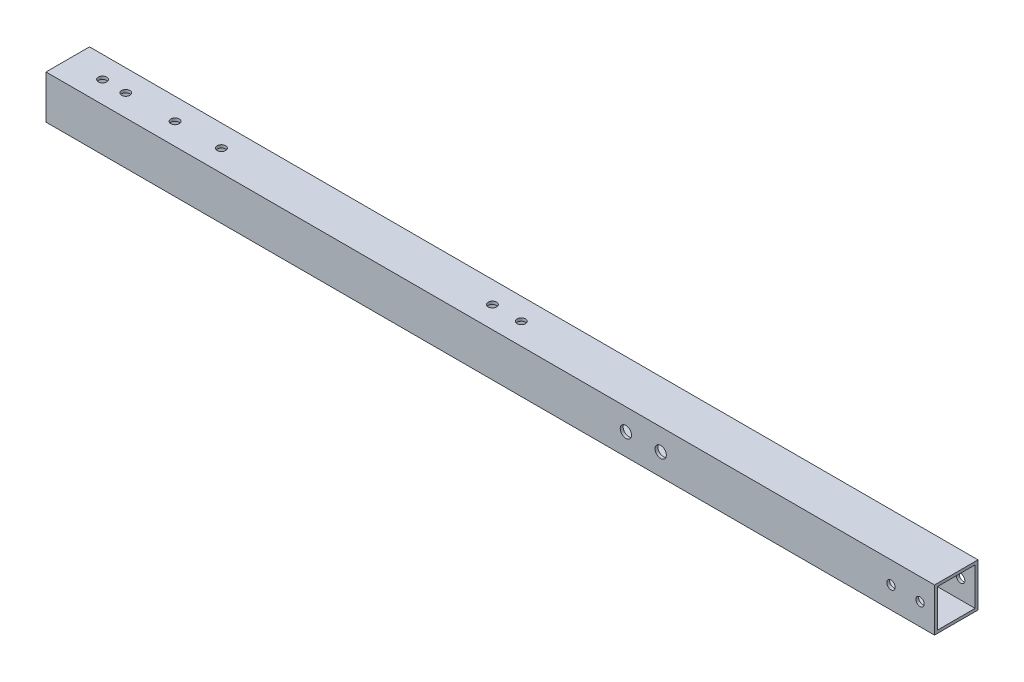
ISO-10303-21;
HEADER;
FILE_DESCRIPTION(('STEP AP214'),'2;1');
FILE_NAME('part.step','',(''),(''),'','','');
FILE_SCHEMA(('AUTOMOTIVE_DESIGN { 1 0 10303 214 1 1 1 1 }'));
ENDSEC;
DATA;
#1=APPLICATION_CONTEXT('core data for automotive mechanical design processes');
#2=APPLICATION_PROTOCOL_DEFINITION('international standard','automotive_design',2000,#1);
#3=PRODUCT_CONTEXT('',#1,'mechanical');
#4=PRODUCT('Part','Part','',(#3));
#5=PRODUCT_RELATED_PRODUCT_CATEGORY('part','',(#4));
#6=PRODUCT_DEFINITION_FORMATION('','',#4);
#7=PRODUCT_DEFINITION_CONTEXT('part definition',#1,'design');
#8=PRODUCT_DEFINITION('design','',#6,#7);
#9=PRODUCT_DEFINITION_SHAPE('','',#8);
#10=(LENGTH_UNIT() NAMED_UNIT(*) SI_UNIT(.MILLI.,.METRE.));
#11=(NAMED_UNIT(*) PLANE_ANGLE_UNIT() SI_UNIT($,.RADIAN.));
#12=(NAMED_UNIT(*) SI_UNIT($,.STERADIAN.) SOLID_ANGLE_UNIT());
#13=UNCERTAINTY_MEASURE_WITH_UNIT(LENGTH_MEASURE(1.E-05),#10,'distance_accuracy_value','');
#14=(GEOMETRIC_REPRESENTATION_CONTEXT(3) GLOBAL_UNCERTAINTY_ASSIGNED_CONTEXT((#13)) GLOBAL_UNIT_ASSIGNED_CONTEXT((#10,
#11,#12)) REPRESENTATION_CONTEXT('',''));
#15=CARTESIAN_POINT('',(0.,0.,0.));
#16=DIRECTION('',(0.,0.,1.));
#17=DIRECTION('',(1.,0.,0.));
#18=AXIS2_PLACEMENT_3D('',#15,#16,#17);
#19=CARTESIAN_POINT('',(306.44,0.,0.));
#20=DIRECTION('',(-1.,0.,0.));
#21=DIRECTION('',(0.,0.,1.));
#22=AXIS2_PLACEMENT_3D('',#19,#20,#21);
#23=PLANE('',#22);
#24=DIRECTION('',(0.,1.,0.));
#25=VECTOR('',#24,1.);
#26=CARTESIAN_POINT('',(306.44,-7.5,-7.5));
#27=LINE('',#26,#25);
#28=CARTESIAN_POINT('',(306.44,-7.5,-7.5));
#29=VERTEX_POINT('',#28);
#30=CARTESIAN_POINT('',(306.44,7.5,-7.5));
#31=VERTEX_POINT('',#30);
#32=EDGE_CURVE('E164',#29,#31,#27,.T.);
#33=ORIENTED_EDGE('',*,*,#32,.T.);
#34=DIRECTION('',(0.,0.,1.));
#35=VECTOR('',#34,1.);
#36=CARTESIAN_POINT('',(306.44,7.5,7.5));
#37=LINE('',#36,#35);
#38=CARTESIAN_POINT('',(306.44,7.5,7.5));
#39=VERTEX_POINT('',#38);
#40=EDGE_CURVE('E168',#31,#39,#37,.T.);
#41=ORIENTED_EDGE('',*,*,#40,.T.);
#42=DIRECTION('',(0.,-1.,0.));
#43=VECTOR('',#42,1.);
#44=CARTESIAN_POINT('',(306.44,-7.5,7.5));
#45=LINE('',#44,#43);
#46=CARTESIAN_POINT('',(306.44,-7.5,7.5));
#47=VERTEX_POINT('',#46);
#48=EDGE_CURVE('E172',#39,#47,#45,.T.);
#49=ORIENTED_EDGE('',*,*,#48,.T.);
#50=DIRECTION('',(0.,0.,-1.));
#51=VECTOR('',#50,1.);
#52=CARTESIAN_POINT('',(306.44,-7.5,7.5));
#53=LINE('',#52,#51);
#54=EDGE_CURVE('E175',#47,#29,#53,.T.);
#55=ORIENTED_EDGE('',*,*,#54,.T.);
#56=EDGE_LOOP('',(#33,#41,#49,#55));
#57=FACE_BOUND('',#56,.T.);
#58=DIRECTION('',(0.,0.,-1.));
#59=VECTOR('',#58,1.);
#60=CARTESIAN_POINT('',(306.44,-6.5,6.5));
#61=LINE('',#60,#59);
#62=CARTESIAN_POINT('',(306.44,-6.5,6.5));
#63=VERTEX_POINT('',#62);
#64=CARTESIAN_POINT('',(306.44,-6.5,-6.5));
#65=VERTEX_POINT('',#64);
#66=EDGE_CURVE('E113',#63,#65,#61,.T.);
#67=ORIENTED_EDGE('',*,*,#66,.F.);
#68=DIRECTION('',(0.,-1.,0.));
#69=VECTOR('',#68,1.);
#70=CARTESIAN_POINT('',(306.44,-6.5,6.5));
#71=LINE('',#70,#69);
#72=CARTESIAN_POINT('',(306.44,6.5,6.5));
#73=VERTEX_POINT('',#72);
#74=EDGE_CURVE('E141',#73,#63,#71,.T.);
#75=ORIENTED_EDGE('',*,*,#74,.F.);
#76=DIRECTION('',(0.,0.,1.));
#77=VECTOR('',#76,1.);
#78=CARTESIAN_POINT('',(306.44,6.5,6.5));
#79=LINE('',#78,#77);
#80=CARTESIAN_POINT('',(306.44,6.5,-6.5));
#81=VERTEX_POINT('',#80);
#82=EDGE_CURVE('E135',#81,#73,#79,.T.);
#83=ORIENTED_EDGE('',*,*,#82,.F.);
#84=DIRECTION('',(0.,1.,0.));
#85=VECTOR('',#84,1.);
#86=CARTESIAN_POINT('',(306.44,-6.5,-6.5));
#87=LINE('',#86,#85);
#88=EDGE_CURVE('E122',#65,#81,#87,.T.);
#89=ORIENTED_EDGE('',*,*,#88,.F.);
#90=EDGE_LOOP('',(#67,#75,#83,#89));
#91=FACE_BOUND('',#90,.T.);
#92=ADVANCED_FACE('F45',(#57,#91),#23,.F.);
#93=CARTESIAN_POINT('',(0.,0.,0.));
#94=DIRECTION('',(-1.,0.,0.));
#95=DIRECTION('',(0.,0.,1.));
#96=AXIS2_PLACEMENT_3D('',#93,#94,#95);
#97=PLANE('',#96);
#98=DIRECTION('',(0.,1.,0.));
#99=VECTOR('',#98,1.);
#100=CARTESIAN_POINT('',(0.,-7.5,-7.5));
#101=LINE('',#100,#99);
#102=CARTESIAN_POINT('',(0.,-7.5,-7.5));
#103=VERTEX_POINT('',#102);
#104=CARTESIAN_POINT('',(0.,7.5,-7.5));
#105=VERTEX_POINT('',#104);
#106=EDGE_CURVE('E131',#103,#105,#101,.T.);
#107=ORIENTED_EDGE('',*,*,#106,.F.);
#108=DIRECTION('',(0.,0.,-1.));
#109=VECTOR('',#108,1.);
#110=CARTESIAN_POINT('',(0.,-7.5,7.5));
#111=LINE('',#110,#109);
#112=CARTESIAN_POINT('',(0.,-7.5,7.5));
#113=VERTEX_POINT('',#112);
#114=EDGE_CURVE('E169',#113,#103,#111,.T.);
#115=ORIENTED_EDGE('',*,*,#114,.F.);
#116=DIRECTION('',(0.,-1.,0.));
#117=VECTOR('',#116,1.);
#118=CARTESIAN_POINT('',(0.,-7.5,7.5));
#119=LINE('',#118,#117);
#120=CARTESIAN_POINT('',(0.,7.5,7.5));
#121=VERTEX_POINT('',#120);
#122=EDGE_CURVE('E185',#121,#113,#119,.T.);
#123=ORIENTED_EDGE('',*,*,#122,.F.);
#124=DIRECTION('',(0.,0.,1.));
#125=VECTOR('',#124,1.);
#126=CARTESIAN_POINT('',(0.,7.5,7.5));
#127=LINE('',#126,#125);
#128=EDGE_CURVE('E182',#105,#121,#127,.T.);
#129=ORIENTED_EDGE('',*,*,#128,.F.);
#130=EDGE_LOOP('',(#107,#115,#123,#129));
#131=FACE_BOUND('',#130,.T.);
#132=DIRECTION('',(0.,-1.,0.));
#133=VECTOR('',#132,1.);
#134=CARTESIAN_POINT('',(0.,-6.5,6.5));
#135=LINE('',#134,#133);
#136=CARTESIAN_POINT('',(0.,6.5,6.5));
#137=VERTEX_POINT('',#136);
#138=CARTESIAN_POINT('',(0.,-6.5,6.5));
#139=VERTEX_POINT('',#138);
#140=EDGE_CURVE('E123',#137,#139,#135,.T.);
#141=ORIENTED_EDGE('',*,*,#140,.T.);
#142=DIRECTION('',(0.,0.,-1.));
#143=VECTOR('',#142,1.);
#144=CARTESIAN_POINT('',(0.,-6.5,6.5));
#145=LINE('',#144,#143);
#146=CARTESIAN_POINT('',(0.,-6.5,-6.5));
#147=VERTEX_POINT('',#146);
#148=EDGE_CURVE('E71',#139,#147,#145,.T.);
#149=ORIENTED_EDGE('',*,*,#148,.T.);
#150=DIRECTION('',(0.,1.,0.));
#151=VECTOR('',#150,1.);
#152=CARTESIAN_POINT('',(0.,-6.5,-6.5));
#153=LINE('',#152,#151);
#154=CARTESIAN_POINT('',(0.,6.5,-6.5));
#155=VERTEX_POINT('',#154);
#156=EDGE_CURVE('E129',#147,#155,#153,.T.);
#157=ORIENTED_EDGE('',*,*,#156,.T.);
#158=DIRECTION('',(0.,0.,1.));
#159=VECTOR('',#158,1.);
#160=CARTESIAN_POINT('',(0.,6.5,6.5));
#161=LINE('',#160,#159);
#162=EDGE_CURVE('E152',#155,#137,#161,.T.);
#163=ORIENTED_EDGE('',*,*,#162,.T.);
#164=EDGE_LOOP('',(#141,#149,#157,#163));
#165=FACE_BOUND('',#164,.T.);
#166=ADVANCED_FACE('F367',(#131,#165),#97,.T.);
#167=CARTESIAN_POINT('',(306.44,-7.5,-7.5));
#168=DIRECTION('',(0.,0.,1.));
#169=DIRECTION('',(1.,0.,0.));
#170=AXIS2_PLACEMENT_3D('',#167,#168,#169);
#171=PLANE('',#170);
#172=CARTESIAN_POINT('',(301.44,1.89060365945489E-12,-7.5));
#173=DIRECTION('',(0.,0.,1.));
#174=DIRECTION('',(1.,0.,0.));
#175=AXIS2_PLACEMENT_3D('',#172,#173,#174);
#176=CIRCLE('',#175,1.45);
#177=CARTESIAN_POINT('',(302.89,1.89060365945489E-12,-7.5));
#178=VERTEX_POINT('',#177);
#179=EDGE_CURVE('E235',#178,#178,#176,.T.);
#180=ORIENTED_EDGE('',*,*,#179,.T.);
#181=EDGE_LOOP('',(#180));
#182=FACE_BOUND('',#181,.T.);
#183=CARTESIAN_POINT('',(212.,0.,-7.5));
#184=DIRECTION('',(0.,0.,1.));
#185=DIRECTION('',(1.,0.,0.));
#186=AXIS2_PLACEMENT_3D('',#183,#184,#185);
#187=CIRCLE('',#186,1.95);
#188=CARTESIAN_POINT('',(213.95,0.,-7.5));
#189=VERTEX_POINT('',#188);
#190=EDGE_CURVE('E470',#189,#189,#187,.T.);
#191=ORIENTED_EDGE('',*,*,#190,.T.);
#192=EDGE_LOOP('',(#191));
#193=FACE_BOUND('',#192,.T.);
#194=CARTESIAN_POINT('',(200.,0.,-7.5));
#195=DIRECTION('',(0.,0.,1.));
#196=DIRECTION('',(1.,0.,0.));
#197=AXIS2_PLACEMENT_3D('',#194,#195,#196);
#198=CIRCLE('',#197,1.95);
#199=CARTESIAN_POINT('',(201.95,0.,-7.5));
#200=VERTEX_POINT('',#199);
#201=EDGE_CURVE('E469',#200,#200,#198,.T.);
#202=ORIENTED_EDGE('',*,*,#201,.T.);
#203=EDGE_LOOP('',(#202));
#204=FACE_BOUND('',#203,.T.);
#205=CARTESIAN_POINT('',(291.44,1.88926615855354E-12,-7.5));
#206=DIRECTION('',(0.,0.,1.));
#207=DIRECTION('',(1.,0.,0.));
#208=AXIS2_PLACEMENT_3D('',#205,#206,#207);
#209=CIRCLE('',#208,1.45);
#210=CARTESIAN_POINT('',(292.89,1.88926615855354E-12,-7.5));
#211=VERTEX_POINT('',#210);
#212=EDGE_CURVE('E477',#211,#211,#209,.T.);
#213=ORIENTED_EDGE('',*,*,#212,.T.);
#214=EDGE_LOOP('',(#213));
#215=FACE_BOUND('',#214,.T.);
#216=ORIENTED_EDGE('',*,*,#106,.T.);
#217=DIRECTION('',(-1.,0.,0.));
#218=VECTOR('',#217,1.);
#219=CARTESIAN_POINT('',(306.44,7.5,-7.5));
#220=LINE('',#219,#218);
#221=EDGE_CURVE('E11',#31,#105,#220,.T.);
#222=ORIENTED_EDGE('',*,*,#221,.F.);
#223=ORIENTED_EDGE('',*,*,#32,.F.);
#224=DIRECTION('',(-1.,0.,0.));
#225=VECTOR('',#224,1.);
#226=CARTESIAN_POINT('',(306.44,-7.5,-7.5));
#227=LINE('',#226,#225);
#228=EDGE_CURVE('E178',#29,#103,#227,.T.);
#229=ORIENTED_EDGE('',*,*,#228,.T.);
#230=EDGE_LOOP('',(#216,#222,#223,#229));
#231=FACE_BOUND('',#230,.T.);
#232=ADVANCED_FACE('F47',(#182,#193,#204,#215,#231),#171,.F.);
#233=CARTESIAN_POINT('',(306.44,7.5,7.5));
#234=DIRECTION('',(0.,-1.,0.));
#235=DIRECTION('',(0.,0.,-1.));
#236=AXIS2_PLACEMENT_3D('',#233,#234,#235);
#237=PLANE('',#236);
#238=CARTESIAN_POINT('',(12.0000000000001,7.5,1.04083408558608E-13));
#239=DIRECTION('',(0.,1.,0.));
#240=DIRECTION('',(0.,0.,1.));
#241=AXIS2_PLACEMENT_3D('',#238,#239,#240);
#242=CIRCLE('',#241,1.45);
#243=CARTESIAN_POINT('',(12.0000000000001,7.5,1.4500000000001));
#244=VERTEX_POINT('',#243);
#245=EDGE_CURVE('E272',#244,#244,#242,.T.);
#246=ORIENTED_EDGE('',*,*,#245,.F.);
#247=EDGE_LOOP('',(#246));
#248=FACE_BOUND('',#247,.T.);
#249=CARTESIAN_POINT('',(37.0000000000003,7.5,0.));
#250=DIRECTION('',(0.,1.,0.));
#251=DIRECTION('',(0.,0.,1.));
#252=AXIS2_PLACEMENT_3D('',#249,#250,#251);
#253=CIRCLE('',#252,1.45);
#254=CARTESIAN_POINT('',(37.0000000000003,7.5,1.45000000000006));
#255=VERTEX_POINT('',#254);
#256=EDGE_CURVE('E280',#255,#255,#253,.T.);
#257=ORIENTED_EDGE('',*,*,#256,.F.);
#258=EDGE_LOOP('',(#257));
#259=FACE_BOUND('',#258,.T.);
#260=CARTESIAN_POINT('',(53.0000000000003,7.5,0.));
#261=DIRECTION('',(0.,1.,0.));
#262=DIRECTION('',(0.,0.,1.));
#263=AXIS2_PLACEMENT_3D('',#260,#261,#262);
#264=CIRCLE('',#263,1.45);
#265=CARTESIAN_POINT('',(53.0000000000003,7.5,1.45000000000006));
#266=VERTEX_POINT('',#265);
#267=EDGE_CURVE('E288',#266,#266,#264,.T.);
#268=ORIENTED_EDGE('',*,*,#267,.F.);
#269=EDGE_LOOP('',(#268));
#270=FACE_BOUND('',#269,.T.);
#271=CARTESIAN_POINT('',(156.44,7.5,0.));
#272=DIRECTION('',(0.,1.,0.));
#273=DIRECTION('',(0.,0.,1.));
#274=AXIS2_PLACEMENT_3D('',#271,#272,#273);
#275=CIRCLE('',#274,1.45);
#276=CARTESIAN_POINT('',(156.44,7.5,1.45));
#277=VERTEX_POINT('',#276);
#278=EDGE_CURVE('E296',#277,#277,#275,.T.);
#279=ORIENTED_EDGE('',*,*,#278,.F.);
#280=EDGE_LOOP('',(#279));
#281=FACE_BOUND('',#280,.T.);
#282=CARTESIAN_POINT('',(146.44,7.5,0.));
#283=DIRECTION('',(0.,1.,0.));
#284=DIRECTION('',(0.,0.,1.));
#285=AXIS2_PLACEMENT_3D('',#282,#283,#284);
#286=CIRCLE('',#285,1.45);
#287=CARTESIAN_POINT('',(146.44,7.5,1.45));
#288=VERTEX_POINT('',#287);
#289=EDGE_CURVE('E264',#288,#288,#286,.T.);
#290=ORIENTED_EDGE('',*,*,#289,.F.);
#291=EDGE_LOOP('',(#290));
#292=FACE_BOUND('',#291,.T.);
#293=CARTESIAN_POINT('',(20.0000000000001,7.5,1.09287578986539E-13));
#294=DIRECTION('',(0.,1.,0.));
#295=DIRECTION('',(0.,0.,1.));
#296=AXIS2_PLACEMENT_3D('',#293,#294,#295);
#297=CIRCLE('',#296,1.45);
#298=CARTESIAN_POINT('',(20.0000000000001,7.5,1.45000000000011));
#299=VERTEX_POINT('',#298);
#300=EDGE_CURVE('E275',#299,#299,#297,.T.);
#301=ORIENTED_EDGE('',*,*,#300,.F.);
#302=EDGE_LOOP('',(#301));
#303=FACE_BOUND('',#302,.T.);
#304=ORIENTED_EDGE('',*,*,#128,.T.);
#305=DIRECTION('',(-1.,0.,0.));
#306=VECTOR('',#305,1.);
#307=CARTESIAN_POINT('',(306.44,7.5,7.5));
#308=LINE('',#307,#306);
#309=EDGE_CURVE('E55',#39,#121,#308,.T.);
#310=ORIENTED_EDGE('',*,*,#309,.F.);
#311=ORIENTED_EDGE('',*,*,#40,.F.);
#312=ORIENTED_EDGE('',*,*,#221,.T.);
#313=EDGE_LOOP('',(#304,#310,#311,#312));
#314=FACE_BOUND('',#313,.T.);
#315=ADVANCED_FACE('F371',(#248,#259,#270,#281,#292,#303,#314),#237,.F.);
#316=CARTESIAN_POINT('',(306.44,-7.5,7.5));
#317=DIRECTION('',(0.,0.,-1.));
#318=DIRECTION('',(-1.,0.,0.));
#319=AXIS2_PLACEMENT_3D('',#316,#317,#318);
#320=PLANE('',#319);
#321=CARTESIAN_POINT('',(301.44,1.89060365945489E-12,7.5));
#322=DIRECTION('',(0.,0.,1.));
#323=DIRECTION('',(1.,0.,0.));
#324=AXIS2_PLACEMENT_3D('',#321,#322,#323);
#325=CIRCLE('',#324,1.45);
#326=CARTESIAN_POINT('',(302.89,1.89060365945489E-12,7.5));
#327=VERTEX_POINT('',#326);
#328=EDGE_CURVE('E458',#327,#327,#325,.T.);
#329=ORIENTED_EDGE('',*,*,#328,.F.);
#330=EDGE_LOOP('',(#329));
#331=FACE_BOUND('',#330,.T.);
#332=CARTESIAN_POINT('',(212.,0.,7.5));
#333=DIRECTION('',(0.,0.,1.));
#334=DIRECTION('',(1.,0.,0.));
#335=AXIS2_PLACEMENT_3D('',#332,#333,#334);
#336=CIRCLE('',#335,1.95);
#337=CARTESIAN_POINT('',(213.95,0.,7.5));
#338=VERTEX_POINT('',#337);
#339=EDGE_CURVE('E465',#338,#338,#336,.T.);
#340=ORIENTED_EDGE('',*,*,#339,.F.);
#341=EDGE_LOOP('',(#340));
#342=FACE_BOUND('',#341,.T.);
#343=CARTESIAN_POINT('',(200.,0.,7.5));
#344=DIRECTION('',(0.,0.,1.));
#345=DIRECTION('',(1.,0.,0.));
#346=AXIS2_PLACEMENT_3D('',#343,#344,#345);
#347=CIRCLE('',#346,1.95);
#348=CARTESIAN_POINT('',(201.95,0.,7.5));
#349=VERTEX_POINT('',#348);
#350=EDGE_CURVE('E481',#349,#349,#347,.T.);
#351=ORIENTED_EDGE('',*,*,#350,.F.);
#352=EDGE_LOOP('',(#351));
#353=FACE_BOUND('',#352,.T.);
#354=CARTESIAN_POINT('',(291.44,1.88926615855354E-12,7.5));
#355=DIRECTION('',(0.,0.,1.));
#356=DIRECTION('',(1.,0.,0.));
#357=AXIS2_PLACEMENT_3D('',#354,#355,#356);
#358=CIRCLE('',#357,1.45);
#359=CARTESIAN_POINT('',(292.89,1.88926615855354E-12,7.5));
#360=VERTEX_POINT('',#359);
#361=EDGE_CURVE('E462',#360,#360,#358,.T.);
#362=ORIENTED_EDGE('',*,*,#361,.F.);
#363=EDGE_LOOP('',(#362));
#364=FACE_BOUND('',#363,.T.);
#365=ORIENTED_EDGE('',*,*,#122,.T.);
#366=DIRECTION('',(-1.,0.,0.));
#367=VECTOR('',#366,1.);
#368=CARTESIAN_POINT('',(306.44,-7.5,7.5));
#369=LINE('',#368,#367);
#370=EDGE_CURVE('E193',#47,#113,#369,.T.);
#371=ORIENTED_EDGE('',*,*,#370,.F.);
#372=ORIENTED_EDGE('',*,*,#48,.F.);
#373=ORIENTED_EDGE('',*,*,#309,.T.);
#374=EDGE_LOOP('',(#365,#371,#372,#373));
#375=FACE_BOUND('',#374,.T.);
#376=ADVANCED_FACE('F354',(#331,#342,#353,#364,#375),#320,.F.);
#377=CARTESIAN_POINT('',(306.44,-7.5,7.5));
#378=DIRECTION('',(0.,1.,0.));
#379=DIRECTION('',(0.,0.,1.));
#380=AXIS2_PLACEMENT_3D('',#377,#378,#379);
#381=PLANE('',#380);
#382=CARTESIAN_POINT('',(12.0000000000001,-7.5,1.04083408558608E-13));
#383=DIRECTION('',(0.,1.,0.));
#384=DIRECTION('',(0.,0.,1.));
#385=AXIS2_PLACEMENT_3D('',#382,#383,#384);
#386=CIRCLE('',#385,1.45);
#387=CARTESIAN_POINT('',(12.0000000000001,-7.5,1.4500000000001));
#388=VERTEX_POINT('',#387);
#389=EDGE_CURVE('E276',#388,#388,#386,.T.);
#390=ORIENTED_EDGE('',*,*,#389,.T.);
#391=EDGE_LOOP('',(#390));
#392=FACE_BOUND('',#391,.T.);
#393=CARTESIAN_POINT('',(37.0000000000003,-7.5,0.));
#394=DIRECTION('',(0.,1.,0.));
#395=DIRECTION('',(0.,0.,1.));
#396=AXIS2_PLACEMENT_3D('',#393,#394,#395);
#397=CIRCLE('',#396,1.45);
#398=CARTESIAN_POINT('',(37.0000000000003,-7.5,1.45000000000006));
#399=VERTEX_POINT('',#398);
#400=EDGE_CURVE('E284',#399,#399,#397,.T.);
#401=ORIENTED_EDGE('',*,*,#400,.T.);
#402=EDGE_LOOP('',(#401));
#403=FACE_BOUND('',#402,.T.);
#404=CARTESIAN_POINT('',(53.0000000000003,-7.5,0.));
#405=DIRECTION('',(0.,1.,0.));
#406=DIRECTION('',(0.,0.,1.));
#407=AXIS2_PLACEMENT_3D('',#404,#405,#406);
#408=CIRCLE('',#407,1.45);
#409=CARTESIAN_POINT('',(53.0000000000003,-7.5,1.45000000000006));
#410=VERTEX_POINT('',#409);
#411=EDGE_CURVE('E292',#410,#410,#408,.T.);
#412=ORIENTED_EDGE('',*,*,#411,.T.);
#413=EDGE_LOOP('',(#412));
#414=FACE_BOUND('',#413,.T.);
#415=CARTESIAN_POINT('',(156.44,-7.5,0.));
#416=DIRECTION('',(0.,1.,0.));
#417=DIRECTION('',(0.,0.,1.));
#418=AXIS2_PLACEMENT_3D('',#415,#416,#417);
#419=CIRCLE('',#418,1.45);
#420=CARTESIAN_POINT('',(156.44,-7.5,1.45));
#421=VERTEX_POINT('',#420);
#422=EDGE_CURVE('E268',#421,#421,#419,.T.);
#423=ORIENTED_EDGE('',*,*,#422,.T.);
#424=EDGE_LOOP('',(#423));
#425=FACE_BOUND('',#424,.T.);
#426=CARTESIAN_POINT('',(146.44,-7.5,0.));
#427=DIRECTION('',(0.,1.,0.));
#428=DIRECTION('',(0.,0.,1.));
#429=AXIS2_PLACEMENT_3D('',#426,#427,#428);
#430=CIRCLE('',#429,1.45);
#431=CARTESIAN_POINT('',(146.44,-7.5,1.45));
#432=VERTEX_POINT('',#431);
#433=EDGE_CURVE('E263',#432,#432,#430,.T.);
#434=ORIENTED_EDGE('',*,*,#433,.T.);
#435=EDGE_LOOP('',(#434));
#436=FACE_BOUND('',#435,.T.);
#437=CARTESIAN_POINT('',(20.0000000000001,-7.5,1.09287578986539E-13));
#438=DIRECTION('',(0.,1.,0.));
#439=DIRECTION('',(0.,0.,1.));
#440=AXIS2_PLACEMENT_3D('',#437,#438,#439);
#441=CIRCLE('',#440,1.45);
#442=CARTESIAN_POINT('',(20.0000000000001,-7.5,1.45000000000011));
#443=VERTEX_POINT('',#442);
#444=EDGE_CURVE('E205',#443,#443,#441,.T.);
#445=ORIENTED_EDGE('',*,*,#444,.T.);
#446=EDGE_LOOP('',(#445));
#447=FACE_BOUND('',#446,.T.);
#448=ORIENTED_EDGE('',*,*,#114,.T.);
#449=ORIENTED_EDGE('',*,*,#228,.F.);
#450=ORIENTED_EDGE('',*,*,#54,.F.);
#451=ORIENTED_EDGE('',*,*,#370,.T.);
#452=EDGE_LOOP('',(#448,#449,#450,#451));
#453=FACE_BOUND('',#452,.T.);
#454=ADVANCED_FACE('F331',(#392,#403,#414,#425,#436,#447,#453),#381,.F.);
#455=CARTESIAN_POINT('',(306.44,-6.5,6.5));
#456=DIRECTION('',(0.,1.,0.));
#457=DIRECTION('',(0.,0.,1.));
#458=AXIS2_PLACEMENT_3D('',#455,#456,#457);
#459=PLANE('',#458);
#460=CARTESIAN_POINT('',(12.0000000000001,-6.5,1.04083408558608E-13));
#461=DIRECTION('',(0.,1.,0.));
#462=DIRECTION('',(0.,0.,1.));
#463=AXIS2_PLACEMENT_3D('',#460,#461,#462);
#464=CIRCLE('',#463,1.45);
#465=CARTESIAN_POINT('',(12.0000000000001,-6.5,1.4500000000001));
#466=VERTEX_POINT('',#465);
#467=EDGE_CURVE('E149',#466,#466,#464,.T.);
#468=ORIENTED_EDGE('',*,*,#467,.F.);
#469=EDGE_LOOP('',(#468));
#470=FACE_BOUND('',#469,.T.);
#471=CARTESIAN_POINT('',(37.0000000000003,-6.5,0.));
#472=DIRECTION('',(0.,1.,0.));
#473=DIRECTION('',(0.,0.,1.));
#474=AXIS2_PLACEMENT_3D('',#471,#472,#473);
#475=CIRCLE('',#474,1.45);
#476=CARTESIAN_POINT('',(37.0000000000003,-6.5,1.45000000000006));
#477=VERTEX_POINT('',#476);
#478=EDGE_CURVE('E225',#477,#477,#475,.T.);
#479=ORIENTED_EDGE('',*,*,#478,.F.);
#480=EDGE_LOOP('',(#479));
#481=FACE_BOUND('',#480,.T.);
#482=CARTESIAN_POINT('',(53.0000000000003,-6.5,0.));
#483=DIRECTION('',(0.,1.,0.));
#484=DIRECTION('',(0.,0.,1.));
#485=AXIS2_PLACEMENT_3D('',#482,#483,#484);
#486=CIRCLE('',#485,1.45);
#487=CARTESIAN_POINT('',(53.0000000000003,-6.5,1.45000000000006));
#488=VERTEX_POINT('',#487);
#489=EDGE_CURVE('E220',#488,#488,#486,.T.);
#490=ORIENTED_EDGE('',*,*,#489,.F.);
#491=EDGE_LOOP('',(#490));
#492=FACE_BOUND('',#491,.T.);
#493=CARTESIAN_POINT('',(156.44,-6.5,0.));
#494=DIRECTION('',(0.,1.,0.));
#495=DIRECTION('',(0.,0.,1.));
#496=AXIS2_PLACEMENT_3D('',#493,#494,#495);
#497=CIRCLE('',#496,1.45);
#498=CARTESIAN_POINT('',(156.44,-6.5,1.45));
#499=VERTEX_POINT('',#498);
#500=EDGE_CURVE('E215',#499,#499,#497,.T.);
#501=ORIENTED_EDGE('',*,*,#500,.F.);
#502=EDGE_LOOP('',(#501));
#503=FACE_BOUND('',#502,.T.);
#504=CARTESIAN_POINT('',(146.44,-6.5,0.));
#505=DIRECTION('',(0.,1.,0.));
#506=DIRECTION('',(0.,0.,1.));
#507=AXIS2_PLACEMENT_3D('',#504,#505,#506);
#508=CIRCLE('',#507,1.45);
#509=CARTESIAN_POINT('',(146.44,-6.5,1.45));
#510=VERTEX_POINT('',#509);
#511=EDGE_CURVE('E210',#510,#510,#508,.T.);
#512=ORIENTED_EDGE('',*,*,#511,.F.);
#513=EDGE_LOOP('',(#512));
#514=FACE_BOUND('',#513,.T.);
#515=CARTESIAN_POINT('',(20.0000000000001,-6.5,1.09287578986539E-13));
#516=DIRECTION('',(0.,1.,0.));
#517=DIRECTION('',(0.,0.,1.));
#518=AXIS2_PLACEMENT_3D('',#515,#516,#517);
#519=CIRCLE('',#518,1.45);
#520=CARTESIAN_POINT('',(20.0000000000001,-6.5,1.45000000000011));
#521=VERTEX_POINT('',#520);
#522=EDGE_CURVE('E204',#521,#521,#519,.T.);
#523=ORIENTED_EDGE('',*,*,#522,.F.);
#524=EDGE_LOOP('',(#523));
#525=FACE_BOUND('',#524,.T.);
#526=ORIENTED_EDGE('',*,*,#148,.F.);
#527=DIRECTION('',(-1.,0.,0.));
#528=VECTOR('',#527,1.);
#529=CARTESIAN_POINT('',(306.44,-6.5,6.5));
#530=LINE('',#529,#528);
#531=EDGE_CURVE('E117',#63,#139,#530,.T.);
#532=ORIENTED_EDGE('',*,*,#531,.F.);
#533=ORIENTED_EDGE('',*,*,#66,.T.);
#534=DIRECTION('',(-1.,0.,0.));
#535=VECTOR('',#534,1.);
#536=CARTESIAN_POINT('',(306.44,-6.5,-6.5));
#537=LINE('',#536,#535);
#538=EDGE_CURVE('E116',#65,#147,#537,.T.);
#539=ORIENTED_EDGE('',*,*,#538,.T.);
#540=EDGE_LOOP('',(#526,#532,#533,#539));
#541=FACE_BOUND('',#540,.T.);
#542=ADVANCED_FACE('F115',(#470,#481,#492,#503,#514,#525,#541),#459,.T.);
#543=CARTESIAN_POINT('',(306.44,-6.5,-6.5));
#544=DIRECTION('',(0.,0.,1.));
#545=DIRECTION('',(0.,-1.,0.));
#546=AXIS2_PLACEMENT_3D('',#543,#544,#545);
#547=PLANE('',#546);
#548=CARTESIAN_POINT('',(301.44,1.89060365945489E-12,-6.5));
#549=DIRECTION('',(0.,0.,1.));
#550=DIRECTION('',(0.,-1.,0.));
#551=AXIS2_PLACEMENT_3D('',#548,#549,#550);
#552=CIRCLE('',#551,1.45);
#553=CARTESIAN_POINT('',(301.44,-1.44999999999811,-6.5));
#554=VERTEX_POINT('',#553);
#555=EDGE_CURVE('E259',#554,#554,#552,.T.);
#556=ORIENTED_EDGE('',*,*,#555,.F.);
#557=EDGE_LOOP('',(#556));
#558=FACE_BOUND('',#557,.T.);
#559=CARTESIAN_POINT('',(212.,0.,-6.5));
#560=DIRECTION('',(0.,0.,1.));
#561=DIRECTION('',(0.,-1.,0.));
#562=AXIS2_PLACEMENT_3D('',#559,#560,#561);
#563=CIRCLE('',#562,1.95);
#564=CARTESIAN_POINT('',(212.,-1.95,-6.5));
#565=VERTEX_POINT('',#564);
#566=EDGE_CURVE('E243',#565,#565,#563,.T.);
#567=ORIENTED_EDGE('',*,*,#566,.F.);
#568=EDGE_LOOP('',(#567));
#569=FACE_BOUND('',#568,.T.);
#570=CARTESIAN_POINT('',(200.,0.,-6.5));
#571=DIRECTION('',(0.,0.,1.));
#572=DIRECTION('',(0.,-1.,0.));
#573=AXIS2_PLACEMENT_3D('',#570,#571,#572);
#574=CIRCLE('',#573,1.95);
#575=CARTESIAN_POINT('',(200.,-1.95,-6.5));
#576=VERTEX_POINT('',#575);
#577=EDGE_CURVE('E239',#576,#576,#574,.T.);
#578=ORIENTED_EDGE('',*,*,#577,.F.);
#579=EDGE_LOOP('',(#578));
#580=FACE_BOUND('',#579,.T.);
#581=CARTESIAN_POINT('',(291.44,1.88926615855354E-12,-6.5));
#582=DIRECTION('',(0.,0.,1.));
#583=DIRECTION('',(0.,-1.,0.));
#584=AXIS2_PLACEMENT_3D('',#581,#582,#583);
#585=CIRCLE('',#584,1.45);
#586=CARTESIAN_POINT('',(291.44,-1.44999999999811,-6.5));
#587=VERTEX_POINT('',#586);
#588=EDGE_CURVE('E234',#587,#587,#585,.T.);
#589=ORIENTED_EDGE('',*,*,#588,.F.);
#590=EDGE_LOOP('',(#589));
#591=FACE_BOUND('',#590,.T.);
#592=ORIENTED_EDGE('',*,*,#156,.F.);
#593=ORIENTED_EDGE('',*,*,#538,.F.);
#594=ORIENTED_EDGE('',*,*,#88,.T.);
#595=DIRECTION('',(-1.,0.,0.));
#596=VECTOR('',#595,1.);
#597=CARTESIAN_POINT('',(306.44,6.5,-6.5));
#598=LINE('',#597,#596);
#599=EDGE_CURVE('E132',#81,#155,#598,.T.);
#600=ORIENTED_EDGE('',*,*,#599,.T.);
#601=EDGE_LOOP('',(#592,#593,#594,#600));
#602=FACE_BOUND('',#601,.T.);
#603=ADVANCED_FACE('F126',(#558,#569,#580,#591,#602),#547,.T.);
#604=CARTESIAN_POINT('',(306.44,6.5,6.5));
#605=DIRECTION('',(0.,-1.,0.));
#606=DIRECTION('',(0.,0.,-1.));
#607=AXIS2_PLACEMENT_3D('',#604,#605,#606);
#608=PLANE('',#607);
#609=CARTESIAN_POINT('',(12.0000000000001,6.5,1.04083408558608E-13));
#610=DIRECTION('',(0.,-1.,0.));
#611=DIRECTION('',(0.,0.,-1.));
#612=AXIS2_PLACEMENT_3D('',#609,#610,#611);
#613=CIRCLE('',#612,1.45);
#614=CARTESIAN_POINT('',(12.0000000000001,6.5,-1.4499999999999));
#615=VERTEX_POINT('',#614);
#616=EDGE_CURVE('E226',#615,#615,#613,.T.);
#617=ORIENTED_EDGE('',*,*,#616,.F.);
#618=EDGE_LOOP('',(#617));
#619=FACE_BOUND('',#618,.T.);
#620=CARTESIAN_POINT('',(37.0000000000003,6.5,0.));
#621=DIRECTION('',(0.,-1.,0.));
#622=DIRECTION('',(0.,0.,-1.));
#623=AXIS2_PLACEMENT_3D('',#620,#621,#622);
#624=CIRCLE('',#623,1.45);
#625=CARTESIAN_POINT('',(37.0000000000003,6.5,-1.44999999999994));
#626=VERTEX_POINT('',#625);
#627=EDGE_CURVE('E221',#626,#626,#624,.T.);
#628=ORIENTED_EDGE('',*,*,#627,.F.);
#629=EDGE_LOOP('',(#628));
#630=FACE_BOUND('',#629,.T.);
#631=CARTESIAN_POINT('',(53.0000000000003,6.5,0.));
#632=DIRECTION('',(0.,-1.,0.));
#633=DIRECTION('',(0.,0.,-1.));
#634=AXIS2_PLACEMENT_3D('',#631,#632,#633);
#635=CIRCLE('',#634,1.45);
#636=CARTESIAN_POINT('',(53.0000000000003,6.5,-1.44999999999994));
#637=VERTEX_POINT('',#636);
#638=EDGE_CURVE('E216',#637,#637,#635,.T.);
#639=ORIENTED_EDGE('',*,*,#638,.F.);
#640=EDGE_LOOP('',(#639));
#641=FACE_BOUND('',#640,.T.);
#642=CARTESIAN_POINT('',(156.44,6.5,0.));
#643=DIRECTION('',(0.,-1.,0.));
#644=DIRECTION('',(0.,0.,-1.));
#645=AXIS2_PLACEMENT_3D('',#642,#643,#644);
#646=CIRCLE('',#645,1.45);
#647=CARTESIAN_POINT('',(156.44,6.5,-1.45));
#648=VERTEX_POINT('',#647);
#649=EDGE_CURVE('E211',#648,#648,#646,.T.);
#650=ORIENTED_EDGE('',*,*,#649,.F.);
#651=EDGE_LOOP('',(#650));
#652=FACE_BOUND('',#651,.T.);
#653=CARTESIAN_POINT('',(146.44,6.5,0.));
#654=DIRECTION('',(0.,-1.,0.));
#655=DIRECTION('',(0.,0.,-1.));
#656=AXIS2_PLACEMENT_3D('',#653,#654,#655);
#657=CIRCLE('',#656,1.45);
#658=CARTESIAN_POINT('',(146.44,6.5,-1.45));
#659=VERTEX_POINT('',#658);
#660=EDGE_CURVE('E206',#659,#659,#657,.T.);
#661=ORIENTED_EDGE('',*,*,#660,.F.);
#662=EDGE_LOOP('',(#661));
#663=FACE_BOUND('',#662,.T.);
#664=CARTESIAN_POINT('',(20.0000000000001,6.5,1.09287578986539E-13));
#665=DIRECTION('',(0.,-1.,0.));
#666=DIRECTION('',(0.,0.,-1.));
#667=AXIS2_PLACEMENT_3D('',#664,#665,#666);
#668=CIRCLE('',#667,1.45);
#669=CARTESIAN_POINT('',(20.0000000000001,6.5,-1.44999999999989));
#670=VERTEX_POINT('',#669);
#671=EDGE_CURVE('E200',#670,#670,#668,.T.);
#672=ORIENTED_EDGE('',*,*,#671,.F.);
#673=EDGE_LOOP('',(#672));
#674=FACE_BOUND('',#673,.T.);
#675=ORIENTED_EDGE('',*,*,#162,.F.);
#676=ORIENTED_EDGE('',*,*,#599,.F.);
#677=ORIENTED_EDGE('',*,*,#82,.T.);
#678=DIRECTION('',(-1.,0.,0.));
#679=VECTOR('',#678,1.);
#680=CARTESIAN_POINT('',(306.44,6.5,6.5));
#681=LINE('',#680,#679);
#682=EDGE_CURVE('E63',#73,#137,#681,.T.);
#683=ORIENTED_EDGE('',*,*,#682,.T.);
#684=EDGE_LOOP('',(#675,#676,#677,#683));
#685=FACE_BOUND('',#684,.T.);
#686=ADVANCED_FACE('F391',(#619,#630,#641,#652,#663,#674,#685),#608,.T.);
#687=CARTESIAN_POINT('',(306.44,-6.5,6.5));
#688=DIRECTION('',(0.,0.,-1.));
#689=DIRECTION('',(-1.,0.,0.));
#690=AXIS2_PLACEMENT_3D('',#687,#688,#689);
#691=PLANE('',#690);
#692=CARTESIAN_POINT('',(301.44,1.89060365945489E-12,6.5));
#693=DIRECTION('',(0.,0.,-1.));
#694=DIRECTION('',(-1.,0.,0.));
#695=AXIS2_PLACEMENT_3D('',#692,#693,#694);
#696=CIRCLE('',#695,1.45);
#697=CARTESIAN_POINT('',(299.99,1.89060365945489E-12,6.5));
#698=VERTEX_POINT('',#697);
#699=EDGE_CURVE('E49',#698,#698,#696,.T.);
#700=ORIENTED_EDGE('',*,*,#699,.F.);
#701=EDGE_LOOP('',(#700));
#702=FACE_BOUND('',#701,.T.);
#703=CARTESIAN_POINT('',(212.,0.,6.5));
#704=DIRECTION('',(0.,0.,-1.));
#705=DIRECTION('',(-1.,0.,0.));
#706=AXIS2_PLACEMENT_3D('',#703,#704,#705);
#707=CIRCLE('',#706,1.95);
#708=CARTESIAN_POINT('',(210.05,0.,6.5));
#709=VERTEX_POINT('',#708);
#710=EDGE_CURVE('E240',#709,#709,#707,.T.);
#711=ORIENTED_EDGE('',*,*,#710,.F.);
#712=EDGE_LOOP('',(#711));
#713=FACE_BOUND('',#712,.T.);
#714=CARTESIAN_POINT('',(200.,0.,6.5));
#715=DIRECTION('',(0.,0.,-1.));
#716=DIRECTION('',(-1.,0.,0.));
#717=AXIS2_PLACEMENT_3D('',#714,#715,#716);
#718=CIRCLE('',#717,1.95);
#719=CARTESIAN_POINT('',(198.05,0.,6.5));
#720=VERTEX_POINT('',#719);
#721=EDGE_CURVE('E236',#720,#720,#718,.T.);
#722=ORIENTED_EDGE('',*,*,#721,.F.);
#723=EDGE_LOOP('',(#722));
#724=FACE_BOUND('',#723,.T.);
#725=CARTESIAN_POINT('',(291.44,1.88926615855354E-12,6.5));
#726=DIRECTION('',(0.,0.,-1.));
#727=DIRECTION('',(-1.,0.,0.));
#728=AXIS2_PLACEMENT_3D('',#725,#726,#727);
#729=CIRCLE('',#728,1.45);
#730=CARTESIAN_POINT('',(289.99,1.88926615855354E-12,6.5));
#731=VERTEX_POINT('',#730);
#732=EDGE_CURVE('E230',#731,#731,#729,.T.);
#733=ORIENTED_EDGE('',*,*,#732,.F.);
#734=EDGE_LOOP('',(#733));
#735=FACE_BOUND('',#734,.T.);
#736=ORIENTED_EDGE('',*,*,#140,.F.);
#737=ORIENTED_EDGE('',*,*,#682,.F.);
#738=ORIENTED_EDGE('',*,*,#74,.T.);
#739=ORIENTED_EDGE('',*,*,#531,.T.);
#740=EDGE_LOOP('',(#736,#737,#738,#739));
#741=FACE_BOUND('',#740,.T.);
#742=ADVANCED_FACE('F395',(#702,#713,#724,#735,#741),#691,.T.);
#743=CARTESIAN_POINT('',(20.0000000000001,-7.5,1.09287578986539E-13));
#744=DIRECTION('',(0.,1.,0.));
#745=DIRECTION('',(0.,0.,1.));
#746=AXIS2_PLACEMENT_3D('',#743,#744,#745);
#747=CYLINDRICAL_SURFACE('',#746,1.45);
#748=ORIENTED_EDGE('',*,*,#671,.T.);
#749=EDGE_LOOP('',(#748));
#750=FACE_BOUND('',#749,.T.);
#751=ORIENTED_EDGE('',*,*,#300,.T.);
#752=EDGE_LOOP('',(#751));
#753=FACE_BOUND('',#752,.T.);
#754=ADVANCED_FACE('F349',(#750,#753),#747,.F.);
#755=CARTESIAN_POINT('',(146.44,-7.5,0.));
#756=DIRECTION('',(0.,1.,0.));
#757=DIRECTION('',(0.,0.,1.));
#758=AXIS2_PLACEMENT_3D('',#755,#756,#757);
#759=CYLINDRICAL_SURFACE('',#758,1.45);
#760=ORIENTED_EDGE('',*,*,#660,.T.);
#761=EDGE_LOOP('',(#760));
#762=FACE_BOUND('',#761,.T.);
#763=ORIENTED_EDGE('',*,*,#289,.T.);
#764=EDGE_LOOP('',(#763));
#765=FACE_BOUND('',#764,.T.);
#766=ADVANCED_FACE('F401',(#762,#765),#759,.F.);
#767=CARTESIAN_POINT('',(156.44,-7.5,0.));
#768=DIRECTION('',(0.,1.,0.));
#769=DIRECTION('',(0.,0.,1.));
#770=AXIS2_PLACEMENT_3D('',#767,#768,#769);
#771=CYLINDRICAL_SURFACE('',#770,1.45);
#772=ORIENTED_EDGE('',*,*,#649,.T.);
#773=EDGE_LOOP('',(#772));
#774=FACE_BOUND('',#773,.T.);
#775=ORIENTED_EDGE('',*,*,#278,.T.);
#776=EDGE_LOOP('',(#775));
#777=FACE_BOUND('',#776,.T.);
#778=ADVANCED_FACE('F403',(#774,#777),#771,.F.);
#779=CARTESIAN_POINT('',(53.0000000000003,-7.5,0.));
#780=DIRECTION('',(0.,1.,0.));
#781=DIRECTION('',(0.,0.,1.));
#782=AXIS2_PLACEMENT_3D('',#779,#780,#781);
#783=CYLINDRICAL_SURFACE('',#782,1.45);
#784=ORIENTED_EDGE('',*,*,#638,.T.);
#785=EDGE_LOOP('',(#784));
#786=FACE_BOUND('',#785,.T.);
#787=ORIENTED_EDGE('',*,*,#267,.T.);
#788=EDGE_LOOP('',(#787));
#789=FACE_BOUND('',#788,.T.);
#790=ADVANCED_FACE('F406',(#786,#789),#783,.F.);
#791=CARTESIAN_POINT('',(37.0000000000003,-7.5,0.));
#792=DIRECTION('',(0.,1.,0.));
#793=DIRECTION('',(0.,0.,1.));
#794=AXIS2_PLACEMENT_3D('',#791,#792,#793);
#795=CYLINDRICAL_SURFACE('',#794,1.45);
#796=ORIENTED_EDGE('',*,*,#627,.T.);
#797=EDGE_LOOP('',(#796));
#798=FACE_BOUND('',#797,.T.);
#799=ORIENTED_EDGE('',*,*,#256,.T.);
#800=EDGE_LOOP('',(#799));
#801=FACE_BOUND('',#800,.T.);
#802=ADVANCED_FACE('F411',(#798,#801),#795,.F.);
#803=CARTESIAN_POINT('',(12.0000000000001,-7.5,1.04083408558608E-13));
#804=DIRECTION('',(0.,1.,0.));
#805=DIRECTION('',(0.,0.,1.));
#806=AXIS2_PLACEMENT_3D('',#803,#804,#805);
#807=CYLINDRICAL_SURFACE('',#806,1.45);
#808=ORIENTED_EDGE('',*,*,#616,.T.);
#809=EDGE_LOOP('',(#808));
#810=FACE_BOUND('',#809,.T.);
#811=ORIENTED_EDGE('',*,*,#245,.T.);
#812=EDGE_LOOP('',(#811));
#813=FACE_BOUND('',#812,.T.);
#814=ADVANCED_FACE('F347',(#810,#813),#807,.F.);
#815=ORIENTED_EDGE('',*,*,#522,.T.);
#816=EDGE_LOOP('',(#815));
#817=FACE_BOUND('',#816,.T.);
#818=ORIENTED_EDGE('',*,*,#444,.F.);
#819=EDGE_LOOP('',(#818));
#820=FACE_BOUND('',#819,.T.);
#821=ADVANCED_FACE('F343',(#817,#820),#747,.F.);
#822=ORIENTED_EDGE('',*,*,#511,.T.);
#823=EDGE_LOOP('',(#822));
#824=FACE_BOUND('',#823,.T.);
#825=ORIENTED_EDGE('',*,*,#433,.F.);
#826=EDGE_LOOP('',(#825));
#827=FACE_BOUND('',#826,.T.);
#828=ADVANCED_FACE('F346',(#824,#827),#759,.F.);
#829=ORIENTED_EDGE('',*,*,#500,.T.);
#830=EDGE_LOOP('',(#829));
#831=FACE_BOUND('',#830,.T.);
#832=ORIENTED_EDGE('',*,*,#422,.F.);
#833=EDGE_LOOP('',(#832));
#834=FACE_BOUND('',#833,.T.);
#835=ADVANCED_FACE('F408',(#831,#834),#771,.F.);
#836=ORIENTED_EDGE('',*,*,#489,.T.);
#837=EDGE_LOOP('',(#836));
#838=FACE_BOUND('',#837,.T.);
#839=ORIENTED_EDGE('',*,*,#411,.F.);
#840=EDGE_LOOP('',(#839));
#841=FACE_BOUND('',#840,.T.);
#842=ADVANCED_FACE('F413',(#838,#841),#783,.F.);
#843=ORIENTED_EDGE('',*,*,#478,.T.);
#844=EDGE_LOOP('',(#843));
#845=FACE_BOUND('',#844,.T.);
#846=ORIENTED_EDGE('',*,*,#400,.F.);
#847=EDGE_LOOP('',(#846));
#848=FACE_BOUND('',#847,.T.);
#849=ADVANCED_FACE('F417',(#845,#848),#795,.F.);
#850=ORIENTED_EDGE('',*,*,#467,.T.);
#851=EDGE_LOOP('',(#850));
#852=FACE_BOUND('',#851,.T.);
#853=ORIENTED_EDGE('',*,*,#389,.F.);
#854=EDGE_LOOP('',(#853));
#855=FACE_BOUND('',#854,.T.);
#856=ADVANCED_FACE('F326',(#852,#855),#807,.F.);
#857=CARTESIAN_POINT('',(291.44,1.88926615855354E-12,-7.5));
#858=DIRECTION('',(0.,0.,1.));
#859=DIRECTION('',(1.,0.,0.));
#860=AXIS2_PLACEMENT_3D('',#857,#858,#859);
#861=CYLINDRICAL_SURFACE('',#860,1.45);
#862=ORIENTED_EDGE('',*,*,#732,.T.);
#863=EDGE_LOOP('',(#862));
#864=FACE_BOUND('',#863,.T.);
#865=ORIENTED_EDGE('',*,*,#361,.T.);
#866=EDGE_LOOP('',(#865));
#867=FACE_BOUND('',#866,.T.);
#868=ADVANCED_FACE('F428',(#864,#867),#861,.F.);
#869=CARTESIAN_POINT('',(200.,0.,-7.5));
#870=DIRECTION('',(0.,0.,1.));
#871=DIRECTION('',(1.,0.,0.));
#872=AXIS2_PLACEMENT_3D('',#869,#870,#871);
#873=CYLINDRICAL_SURFACE('',#872,1.95);
#874=ORIENTED_EDGE('',*,*,#721,.T.);
#875=EDGE_LOOP('',(#874));
#876=FACE_BOUND('',#875,.T.);
#877=ORIENTED_EDGE('',*,*,#350,.T.);
#878=EDGE_LOOP('',(#877));
#879=FACE_BOUND('',#878,.T.);
#880=ADVANCED_FACE('F424',(#876,#879),#873,.F.);
#881=CARTESIAN_POINT('',(212.,0.,-7.5));
#882=DIRECTION('',(0.,0.,1.));
#883=DIRECTION('',(1.,0.,0.));
#884=AXIS2_PLACEMENT_3D('',#881,#882,#883);
#885=CYLINDRICAL_SURFACE('',#884,1.95);
#886=ORIENTED_EDGE('',*,*,#710,.T.);
#887=EDGE_LOOP('',(#886));
#888=FACE_BOUND('',#887,.T.);
#889=ORIENTED_EDGE('',*,*,#339,.T.);
#890=EDGE_LOOP('',(#889));
#891=FACE_BOUND('',#890,.T.);
#892=ADVANCED_FACE('F427',(#888,#891),#885,.F.);
#893=CARTESIAN_POINT('',(301.44,1.89060365945489E-12,-7.5));
#894=DIRECTION('',(0.,0.,1.));
#895=DIRECTION('',(1.,0.,0.));
#896=AXIS2_PLACEMENT_3D('',#893,#894,#895);
#897=CYLINDRICAL_SURFACE('',#896,1.45);
#898=ORIENTED_EDGE('',*,*,#699,.T.);
#899=EDGE_LOOP('',(#898));
#900=FACE_BOUND('',#899,.T.);
#901=ORIENTED_EDGE('',*,*,#328,.T.);
#902=EDGE_LOOP('',(#901));
#903=FACE_BOUND('',#902,.T.);
#904=ADVANCED_FACE('F437',(#900,#903),#897,.F.);
#905=ORIENTED_EDGE('',*,*,#588,.T.);
#906=EDGE_LOOP('',(#905));
#907=FACE_BOUND('',#906,.T.);
#908=ORIENTED_EDGE('',*,*,#212,.F.);
#909=EDGE_LOOP('',(#908));
#910=FACE_BOUND('',#909,.T.);
#911=ADVANCED_FACE('F434',(#907,#910),#861,.F.);
#912=ORIENTED_EDGE('',*,*,#577,.T.);
#913=EDGE_LOOP('',(#912));
#914=FACE_BOUND('',#913,.T.);
#915=ORIENTED_EDGE('',*,*,#201,.F.);
#916=EDGE_LOOP('',(#915));
#917=FACE_BOUND('',#916,.T.);
#918=ADVANCED_FACE('F430',(#914,#917),#873,.F.);
#919=ORIENTED_EDGE('',*,*,#566,.T.);
#920=EDGE_LOOP('',(#919));
#921=FACE_BOUND('',#920,.T.);
#922=ORIENTED_EDGE('',*,*,#190,.F.);
#923=EDGE_LOOP('',(#922));
#924=FACE_BOUND('',#923,.T.);
#925=ADVANCED_FACE('F438',(#921,#924),#885,.F.);
#926=ORIENTED_EDGE('',*,*,#555,.T.);
#927=EDGE_LOOP('',(#926));
#928=FACE_BOUND('',#927,.T.);
#929=ORIENTED_EDGE('',*,*,#179,.F.);
#930=EDGE_LOOP('',(#929));
#931=FACE_BOUND('',#930,.T.);
#932=ADVANCED_FACE('F441',(#928,#931),#897,.F.);
#933=CLOSED_SHELL('',(#92,#166,#232,#315,#376,#454,#542,#603,#686,#742,#754,#766,#778,#790,#802,
#814,#821,#828,#835,#842,#849,#856,#868,#880,#892,#904,#911,#918,#925,#932));
#934=MANIFOLD_SOLID_BREP('B2',#933);
#935=ADVANCED_BREP_SHAPE_REPRESENTATION('',(#18,#934),#14);
#936=SHAPE_DEFINITION_REPRESENTATION(#9,#935);
ENDSEC;
END-ISO-10303-21;
